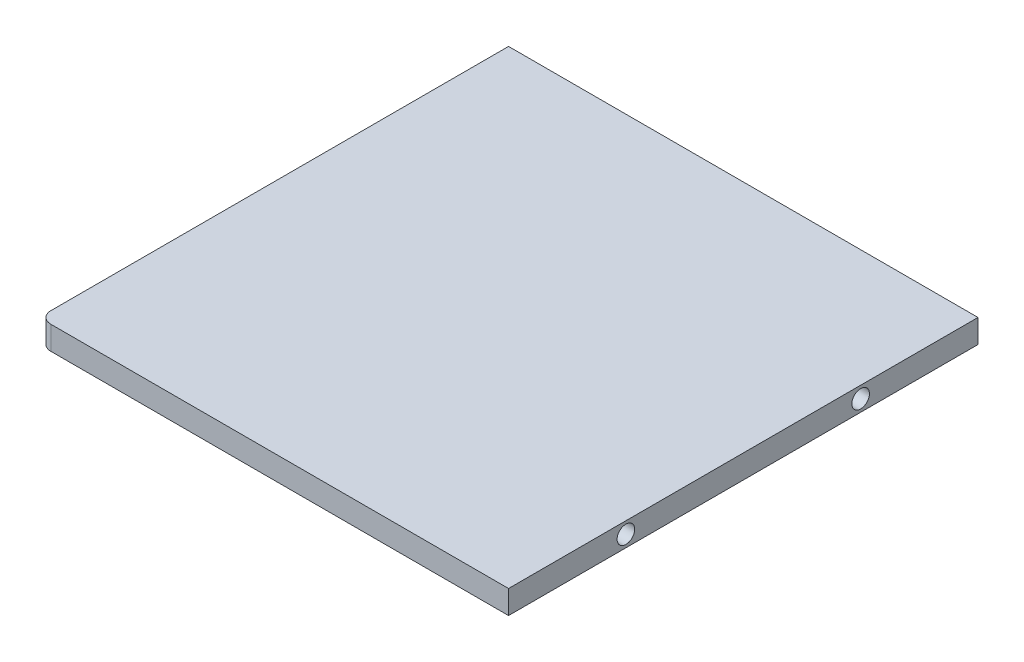
ISO-10303-21;
HEADER;
FILE_DESCRIPTION(('STEP AP214'),'2;1');
FILE_NAME('part.step','',(''),(''),'','','');
FILE_SCHEMA(('AUTOMOTIVE_DESIGN { 1 0 10303 214 1 1 1 1 }'));
ENDSEC;
DATA;
#1=APPLICATION_CONTEXT('core data for automotive mechanical design processes');
#2=APPLICATION_PROTOCOL_DEFINITION('international standard','automotive_design',2000,#1);
#3=PRODUCT_CONTEXT('',#1,'mechanical');
#4=PRODUCT('Part','Part','',(#3));
#5=PRODUCT_RELATED_PRODUCT_CATEGORY('part','',(#4));
#6=PRODUCT_DEFINITION_FORMATION('','',#4);
#7=PRODUCT_DEFINITION_CONTEXT('part definition',#1,'design');
#8=PRODUCT_DEFINITION('design','',#6,#7);
#9=PRODUCT_DEFINITION_SHAPE('','',#8);
#10=(LENGTH_UNIT() NAMED_UNIT(*) SI_UNIT(.MILLI.,.METRE.));
#11=(NAMED_UNIT(*) PLANE_ANGLE_UNIT() SI_UNIT($,.RADIAN.));
#12=(NAMED_UNIT(*) SI_UNIT($,.STERADIAN.) SOLID_ANGLE_UNIT());
#13=UNCERTAINTY_MEASURE_WITH_UNIT(LENGTH_MEASURE(1.E-05),#10,'distance_accuracy_value','');
#14=(GEOMETRIC_REPRESENTATION_CONTEXT(3) GLOBAL_UNCERTAINTY_ASSIGNED_CONTEXT((#13)) GLOBAL_UNIT_ASSIGNED_CONTEXT((#10,
#11,#12)) REPRESENTATION_CONTEXT('',''));
#15=CARTESIAN_POINT('',(0.,0.,0.));
#16=DIRECTION('',(0.,0.,1.));
#17=DIRECTION('',(1.,0.,0.));
#18=AXIS2_PLACEMENT_3D('',#15,#16,#17);
#19=CARTESIAN_POINT('',(80.,-2.,0.));
#20=DIRECTION('',(0.,-1.,0.));
#21=DIRECTION('',(0.,0.,-1.));
#22=AXIS2_PLACEMENT_3D('',#19,#20,#21);
#23=PLANE('',#22);
#24=CARTESIAN_POINT('',(6.5,-2.,-3.75));
#25=DIRECTION('',(0.,-1.,0.));
#26=DIRECTION('',(0.,0.,-1.));
#27=AXIS2_PLACEMENT_3D('',#24,#25,#26);
#28=CIRCLE('',#27,0.749999999999998);
#29=CARTESIAN_POINT('',(6.5,-2.,-4.5));
#30=VERTEX_POINT('',#29);
#31=EDGE_CURVE('E220',#30,#30,#28,.T.);
#32=ORIENTED_EDGE('',*,*,#31,.F.);
#33=EDGE_LOOP('',(#32));
#34=FACE_BOUND('',#33,.T.);
#35=DIRECTION('',(0.,0.,1.));
#36=VECTOR('',#35,1.);
#37=CARTESIAN_POINT('',(40.,-2.,0.));
#38=LINE('',#37,#36);
#39=CARTESIAN_POINT('',(40.,-2.,-40.0000000000008));
#40=VERTEX_POINT('',#39);
#41=CARTESIAN_POINT('',(40.,-2.,0.));
#42=VERTEX_POINT('',#41);
#43=EDGE_CURVE('E99',#40,#42,#38,.T.);
#44=ORIENTED_EDGE('',*,*,#43,.T.);
#45=DIRECTION('',(-1.,0.,0.));
#46=VECTOR('',#45,1.);
#47=CARTESIAN_POINT('',(80.,-2.,0.));
#48=LINE('',#47,#46);
#49=CARTESIAN_POINT('',(1.,-2.,0.));
#50=VERTEX_POINT('',#49);
#51=EDGE_CURVE('E64',#42,#50,#48,.T.);
#52=ORIENTED_EDGE('',*,*,#51,.T.);
#53=CARTESIAN_POINT('',(1.,-2.,-1.));
#54=DIRECTION('',(0.,-1.,0.));
#55=DIRECTION('',(0.,0.,-1.));
#56=AXIS2_PLACEMENT_3D('',#53,#54,#55);
#57=CIRCLE('',#56,1.);
#58=CARTESIAN_POINT('',(0.,-2.,-1.));
#59=VERTEX_POINT('',#58);
#60=EDGE_CURVE('E11',#50,#59,#57,.T.);
#61=ORIENTED_EDGE('',*,*,#60,.T.);
#62=DIRECTION('',(0.,0.,1.));
#63=VECTOR('',#62,1.);
#64=CARTESIAN_POINT('',(0.,-2.,0.));
#65=LINE('',#64,#63);
#66=CARTESIAN_POINT('',(0.,-1.99999999999999,-40.0000000000008));
#67=VERTEX_POINT('',#66);
#68=EDGE_CURVE('E105',#67,#59,#65,.T.);
#69=ORIENTED_EDGE('',*,*,#68,.F.);
#70=DIRECTION('',(1.,0.,0.));
#71=VECTOR('',#70,1.);
#72=CARTESIAN_POINT('',(0.,-2.,-40.0000000000008));
#73=LINE('',#72,#71);
#74=EDGE_CURVE('E57',#67,#40,#73,.T.);
#75=ORIENTED_EDGE('',*,*,#74,.T.);
#76=EDGE_LOOP('',(#44,#52,#61,#69,#75));
#77=FACE_BOUND('',#76,.T.);
#78=ADVANCED_FACE('F41',(#34,#77),#23,.T.);
#79=CARTESIAN_POINT('',(80.,0.,0.));
#80=DIRECTION('',(0.,1.,0.));
#81=DIRECTION('',(0.,0.,1.));
#82=AXIS2_PLACEMENT_3D('',#79,#80,#81);
#83=PLANE('',#82);
#84=DIRECTION('',(0.,0.,1.));
#85=VECTOR('',#84,1.);
#86=CARTESIAN_POINT('',(40.,0.,0.));
#87=LINE('',#86,#85);
#88=CARTESIAN_POINT('',(40.,0.,-40.0000000000008));
#89=VERTEX_POINT('',#88);
#90=CARTESIAN_POINT('',(40.,0.,0.));
#91=VERTEX_POINT('',#90);
#92=EDGE_CURVE('E123',#89,#91,#87,.T.);
#93=ORIENTED_EDGE('',*,*,#92,.F.);
#94=DIRECTION('',(1.,0.,0.));
#95=VECTOR('',#94,1.);
#96=CARTESIAN_POINT('',(80.,0.,-40.0000000000008));
#97=LINE('',#96,#95);
#98=CARTESIAN_POINT('',(0.,0.,-40.0000000000008));
#99=VERTEX_POINT('',#98);
#100=EDGE_CURVE('E92',#99,#89,#97,.T.);
#101=ORIENTED_EDGE('',*,*,#100,.F.);
#102=DIRECTION('',(0.,0.,-1.));
#103=VECTOR('',#102,1.);
#104=CARTESIAN_POINT('',(0.,0.,0.));
#105=LINE('',#104,#103);
#106=CARTESIAN_POINT('',(0.,0.,-1.));
#107=VERTEX_POINT('',#106);
#108=EDGE_CURVE('E128',#107,#99,#105,.T.);
#109=ORIENTED_EDGE('',*,*,#108,.F.);
#110=CARTESIAN_POINT('',(1.,0.,-1.));
#111=DIRECTION('',(0.,1.,0.));
#112=DIRECTION('',(0.,0.,1.));
#113=AXIS2_PLACEMENT_3D('',#110,#111,#112);
#114=CIRCLE('',#113,1.);
#115=CARTESIAN_POINT('',(1.,0.,0.));
#116=VERTEX_POINT('',#115);
#117=EDGE_CURVE('E141',#107,#116,#114,.T.);
#118=ORIENTED_EDGE('',*,*,#117,.T.);
#119=DIRECTION('',(-1.,0.,0.));
#120=VECTOR('',#119,1.);
#121=CARTESIAN_POINT('',(80.,0.,0.));
#122=LINE('',#121,#120);
#123=EDGE_CURVE('E134',#91,#116,#122,.T.);
#124=ORIENTED_EDGE('',*,*,#123,.F.);
#125=EDGE_LOOP('',(#93,#101,#109,#118,#124));
#126=FACE_BOUND('',#125,.T.);
#127=ADVANCED_FACE('F156',(#126),#83,.T.);
#128=CARTESIAN_POINT('',(80.,0.,0.));
#129=DIRECTION('',(0.,0.,1.));
#130=DIRECTION('',(1.,0.,0.));
#131=AXIS2_PLACEMENT_3D('',#128,#129,#130);
#132=PLANE('',#131);
#133=DIRECTION('',(0.,1.,0.));
#134=VECTOR('',#133,1.);
#135=CARTESIAN_POINT('',(40.,-2.,0.));
#136=LINE('',#135,#134);
#137=EDGE_CURVE('E96',#42,#91,#136,.T.);
#138=ORIENTED_EDGE('',*,*,#137,.T.);
#139=ORIENTED_EDGE('',*,*,#123,.T.);
#140=DIRECTION('',(0.,1.,0.));
#141=VECTOR('',#140,1.);
#142=CARTESIAN_POINT('',(1.,-2.,0.));
#143=LINE('',#142,#141);
#144=EDGE_CURVE('E50',#116,#50,#143,.F.);
#145=ORIENTED_EDGE('',*,*,#144,.T.);
#146=ORIENTED_EDGE('',*,*,#51,.F.);
#147=EDGE_LOOP('',(#138,#139,#145,#146));
#148=FACE_BOUND('',#147,.T.);
#149=ADVANCED_FACE('F148',(#148),#132,.T.);
#150=CARTESIAN_POINT('',(0.,0.,0.));
#151=DIRECTION('',(1.,0.,0.));
#152=DIRECTION('',(0.,0.,-1.));
#153=AXIS2_PLACEMENT_3D('',#150,#151,#152);
#154=PLANE('',#153);
#155=ORIENTED_EDGE('',*,*,#108,.T.);
#156=DIRECTION('',(0.,1.,0.));
#157=VECTOR('',#156,1.);
#158=CARTESIAN_POINT('',(0.,-2.,-40.0000000000008));
#159=LINE('',#158,#157);
#160=EDGE_CURVE('E97',#67,#99,#159,.T.);
#161=ORIENTED_EDGE('',*,*,#160,.F.);
#162=ORIENTED_EDGE('',*,*,#68,.T.);
#163=DIRECTION('',(0.,1.,0.));
#164=VECTOR('',#163,1.);
#165=CARTESIAN_POINT('',(0.,0.,-1.));
#166=LINE('',#165,#164);
#167=EDGE_CURVE('E137',#59,#107,#166,.T.);
#168=ORIENTED_EDGE('',*,*,#167,.T.);
#169=EDGE_LOOP('',(#155,#161,#162,#168));
#170=FACE_BOUND('',#169,.T.);
#171=ADVANCED_FACE('F154',(#170),#154,.F.);
#172=CARTESIAN_POINT('',(1.,0.,-1.));
#173=DIRECTION('',(0.,-1.,0.));
#174=DIRECTION('',(0.,0.,-1.));
#175=AXIS2_PLACEMENT_3D('',#172,#173,#174);
#176=CYLINDRICAL_SURFACE('',#175,1.);
#177=ORIENTED_EDGE('',*,*,#60,.F.);
#178=ORIENTED_EDGE('',*,*,#144,.F.);
#179=ORIENTED_EDGE('',*,*,#117,.F.);
#180=ORIENTED_EDGE('',*,*,#167,.F.);
#181=EDGE_LOOP('',(#177,#178,#179,#180));
#182=FACE_BOUND('',#181,.T.);
#183=ADVANCED_FACE('F43',(#182),#176,.T.);
#184=CARTESIAN_POINT('',(40.,-2.,0.));
#185=DIRECTION('',(-1.,0.,0.));
#186=DIRECTION('',(0.,0.,1.));
#187=AXIS2_PLACEMENT_3D('',#184,#185,#186);
#188=PLANE('',#187);
#189=CARTESIAN_POINT('',(40.,-1.,-10.));
#190=DIRECTION('',(1.,0.,0.));
#191=DIRECTION('',(0.,0.,-1.));
#192=AXIS2_PLACEMENT_3D('',#189,#190,#191);
#193=CIRCLE('',#192,0.75);
#194=CARTESIAN_POINT('',(40.,-1.,-10.75));
#195=VERTEX_POINT('',#194);
#196=EDGE_CURVE('E234',#195,#195,#193,.T.);
#197=ORIENTED_EDGE('',*,*,#196,.F.);
#198=EDGE_LOOP('',(#197));
#199=FACE_BOUND('',#198,.T.);
#200=CARTESIAN_POINT('',(40.,-1.,-30.0000000000008));
#201=DIRECTION('',(1.,0.,0.));
#202=DIRECTION('',(0.,0.,-1.));
#203=AXIS2_PLACEMENT_3D('',#200,#201,#202);
#204=CIRCLE('',#203,0.750000000000002);
#205=CARTESIAN_POINT('',(40.,-1.,-30.7500000000008));
#206=VERTEX_POINT('',#205);
#207=EDGE_CURVE('E225',#206,#206,#204,.T.);
#208=ORIENTED_EDGE('',*,*,#207,.F.);
#209=EDGE_LOOP('',(#208));
#210=FACE_BOUND('',#209,.T.);
#211=ORIENTED_EDGE('',*,*,#92,.T.);
#212=ORIENTED_EDGE('',*,*,#137,.F.);
#213=ORIENTED_EDGE('',*,*,#43,.F.);
#214=DIRECTION('',(0.,1.,0.));
#215=VECTOR('',#214,1.);
#216=CARTESIAN_POINT('',(40.,-2.,-40.0000000000008));
#217=LINE('',#216,#215);
#218=EDGE_CURVE('E88',#40,#89,#217,.T.);
#219=ORIENTED_EDGE('',*,*,#218,.T.);
#220=EDGE_LOOP('',(#211,#212,#213,#219));
#221=FACE_BOUND('',#220,.T.);
#222=ADVANCED_FACE('F100',(#199,#210,#221),#188,.F.);
#223=CARTESIAN_POINT('',(0.,-2.,-40.0000000000008));
#224=DIRECTION('',(0.,0.,1.));
#225=DIRECTION('',(1.,0.,0.));
#226=AXIS2_PLACEMENT_3D('',#223,#224,#225);
#227=PLANE('',#226);
#228=CARTESIAN_POINT('',(30.,-1.,-40.0000000000008));
#229=DIRECTION('',(0.,0.,-1.));
#230=DIRECTION('',(-1.,0.,0.));
#231=AXIS2_PLACEMENT_3D('',#228,#229,#230);
#232=CIRCLE('',#231,0.750000000000002);
#233=CARTESIAN_POINT('',(29.25,-1.,-40.0000000000008));
#234=VERTEX_POINT('',#233);
#235=EDGE_CURVE('E111',#234,#234,#232,.T.);
#236=ORIENTED_EDGE('',*,*,#235,.F.);
#237=EDGE_LOOP('',(#236));
#238=FACE_BOUND('',#237,.T.);
#239=CARTESIAN_POINT('',(9.99999999999999,-0.999999999999998,-40.0000000000008));
#240=DIRECTION('',(0.,0.,-1.));
#241=DIRECTION('',(-1.,0.,0.));
#242=AXIS2_PLACEMENT_3D('',#239,#240,#241);
#243=CIRCLE('',#242,0.75);
#244=CARTESIAN_POINT('',(9.24999999999999,-0.999999999999998,-40.0000000000008));
#245=VERTEX_POINT('',#244);
#246=EDGE_CURVE('E243',#245,#245,#243,.T.);
#247=ORIENTED_EDGE('',*,*,#246,.F.);
#248=EDGE_LOOP('',(#247));
#249=FACE_BOUND('',#248,.T.);
#250=ORIENTED_EDGE('',*,*,#100,.T.);
#251=ORIENTED_EDGE('',*,*,#218,.F.);
#252=ORIENTED_EDGE('',*,*,#74,.F.);
#253=ORIENTED_EDGE('',*,*,#160,.T.);
#254=EDGE_LOOP('',(#250,#251,#252,#253));
#255=FACE_BOUND('',#254,.T.);
#256=ADVANCED_FACE('F90',(#238,#249,#255),#227,.F.);
#257=CARTESIAN_POINT('',(9.99999999999999,-0.999999999999998,-35.0000000000008));
#258=DIRECTION('',(0.,0.,-1.));
#259=DIRECTION('',(-1.,0.,0.));
#260=AXIS2_PLACEMENT_3D('',#257,#258,#259);
#261=CYLINDRICAL_SURFACE('',#260,0.75);
#262=CARTESIAN_POINT('',(9.99999999999999,-0.999999999999998,-35.0000000000008));
#263=DIRECTION('',(0.,0.,-1.));
#264=DIRECTION('',(-1.,0.,0.));
#265=AXIS2_PLACEMENT_3D('',#262,#263,#264);
#266=CIRCLE('',#265,0.75);
#267=CARTESIAN_POINT('',(9.24999999999999,-0.999999999999998,-35.0000000000008));
#268=VERTEX_POINT('',#267);
#269=EDGE_CURVE('E114',#268,#268,#266,.T.);
#270=ORIENTED_EDGE('',*,*,#269,.F.);
#271=EDGE_LOOP('',(#270));
#272=FACE_BOUND('',#271,.T.);
#273=ORIENTED_EDGE('',*,*,#246,.T.);
#274=EDGE_LOOP('',(#273));
#275=FACE_BOUND('',#274,.T.);
#276=ADVANCED_FACE('F170',(#272,#275),#261,.F.);
#277=CARTESIAN_POINT('',(9.99999999999999,-0.999999999999998,-35.0000000000008));
#278=DIRECTION('',(0.,0.,-1.));
#279=DIRECTION('',(-1.,0.,0.));
#280=AXIS2_PLACEMENT_3D('',#277,#278,#279);
#281=PLANE('',#280);
#282=ORIENTED_EDGE('',*,*,#269,.T.);
#283=EDGE_LOOP('',(#282));
#284=FACE_BOUND('',#283,.T.);
#285=ADVANCED_FACE('F175',(#284),#281,.T.);
#286=CARTESIAN_POINT('',(30.,-1.,-35.0000000000008));
#287=DIRECTION('',(0.,0.,-1.));
#288=DIRECTION('',(-1.,0.,0.));
#289=AXIS2_PLACEMENT_3D('',#286,#287,#288);
#290=CYLINDRICAL_SURFACE('',#289,0.750000000000002);
#291=CARTESIAN_POINT('',(30.,-1.,-35.0000000000008));
#292=DIRECTION('',(0.,0.,-1.));
#293=DIRECTION('',(-1.,0.,0.));
#294=AXIS2_PLACEMENT_3D('',#291,#292,#293);
#295=CIRCLE('',#294,0.750000000000002);
#296=CARTESIAN_POINT('',(29.25,-1.,-35.0000000000008));
#297=VERTEX_POINT('',#296);
#298=EDGE_CURVE('E107',#297,#297,#295,.T.);
#299=ORIENTED_EDGE('',*,*,#298,.F.);
#300=EDGE_LOOP('',(#299));
#301=FACE_BOUND('',#300,.T.);
#302=ORIENTED_EDGE('',*,*,#235,.T.);
#303=EDGE_LOOP('',(#302));
#304=FACE_BOUND('',#303,.T.);
#305=ADVANCED_FACE('F178',(#301,#304),#290,.F.);
#306=CARTESIAN_POINT('',(30.,-1.,-35.0000000000008));
#307=DIRECTION('',(0.,0.,-1.));
#308=DIRECTION('',(-1.,0.,0.));
#309=AXIS2_PLACEMENT_3D('',#306,#307,#308);
#310=PLANE('',#309);
#311=ORIENTED_EDGE('',*,*,#298,.T.);
#312=EDGE_LOOP('',(#311));
#313=FACE_BOUND('',#312,.T.);
#314=ADVANCED_FACE('F185',(#313),#310,.T.);
#315=CARTESIAN_POINT('',(35.,-1.,-30.0000000000008));
#316=DIRECTION('',(1.,0.,0.));
#317=DIRECTION('',(0.,0.,-1.));
#318=AXIS2_PLACEMENT_3D('',#315,#316,#317);
#319=CYLINDRICAL_SURFACE('',#318,0.750000000000002);
#320=CARTESIAN_POINT('',(35.,-1.,-30.0000000000008));
#321=DIRECTION('',(1.,0.,0.));
#322=DIRECTION('',(0.,0.,-1.));
#323=AXIS2_PLACEMENT_3D('',#320,#321,#322);
#324=CIRCLE('',#323,0.750000000000002);
#325=CARTESIAN_POINT('',(35.,-1.,-30.7500000000008));
#326=VERTEX_POINT('',#325);
#327=EDGE_CURVE('E219',#326,#326,#324,.T.);
#328=ORIENTED_EDGE('',*,*,#327,.F.);
#329=EDGE_LOOP('',(#328));
#330=FACE_BOUND('',#329,.T.);
#331=ORIENTED_EDGE('',*,*,#207,.T.);
#332=EDGE_LOOP('',(#331));
#333=FACE_BOUND('',#332,.T.);
#334=ADVANCED_FACE('F189',(#330,#333),#319,.F.);
#335=CARTESIAN_POINT('',(35.,-1.,-30.0000000000008));
#336=DIRECTION('',(1.,0.,0.));
#337=DIRECTION('',(0.,0.,-1.));
#338=AXIS2_PLACEMENT_3D('',#335,#336,#337);
#339=PLANE('',#338);
#340=ORIENTED_EDGE('',*,*,#327,.T.);
#341=EDGE_LOOP('',(#340));
#342=FACE_BOUND('',#341,.T.);
#343=ADVANCED_FACE('F191',(#342),#339,.T.);
#344=CARTESIAN_POINT('',(35.,-1.,-10.));
#345=DIRECTION('',(1.,0.,0.));
#346=DIRECTION('',(0.,0.,-1.));
#347=AXIS2_PLACEMENT_3D('',#344,#345,#346);
#348=CYLINDRICAL_SURFACE('',#347,0.75);
#349=CARTESIAN_POINT('',(35.,-1.,-10.));
#350=DIRECTION('',(1.,0.,0.));
#351=DIRECTION('',(0.,0.,-1.));
#352=AXIS2_PLACEMENT_3D('',#349,#350,#351);
#353=CIRCLE('',#352,0.75);
#354=CARTESIAN_POINT('',(35.,-1.,-10.75));
#355=VERTEX_POINT('',#354);
#356=EDGE_CURVE('E230',#355,#355,#353,.T.);
#357=ORIENTED_EDGE('',*,*,#356,.F.);
#358=EDGE_LOOP('',(#357));
#359=FACE_BOUND('',#358,.T.);
#360=ORIENTED_EDGE('',*,*,#196,.T.);
#361=EDGE_LOOP('',(#360));
#362=FACE_BOUND('',#361,.T.);
#363=ADVANCED_FACE('F194',(#359,#362),#348,.F.);
#364=CARTESIAN_POINT('',(35.,-1.,-10.));
#365=DIRECTION('',(1.,0.,0.));
#366=DIRECTION('',(0.,0.,-1.));
#367=AXIS2_PLACEMENT_3D('',#364,#365,#366);
#368=PLANE('',#367);
#369=ORIENTED_EDGE('',*,*,#356,.T.);
#370=EDGE_LOOP('',(#369));
#371=FACE_BOUND('',#370,.T.);
#372=ADVANCED_FACE('F201',(#371),#368,.T.);
#373=CARTESIAN_POINT('',(6.5,-1.,-3.75));
#374=DIRECTION('',(0.,-1.,0.));
#375=DIRECTION('',(0.,0.,-1.));
#376=AXIS2_PLACEMENT_3D('',#373,#374,#375);
#377=CYLINDRICAL_SURFACE('',#376,0.749999999999998);
#378=CARTESIAN_POINT('',(6.5,-1.,-3.75));
#379=DIRECTION('',(0.,-1.,0.));
#380=DIRECTION('',(0.,0.,-1.));
#381=AXIS2_PLACEMENT_3D('',#378,#379,#380);
#382=CIRCLE('',#381,0.749999999999998);
#383=CARTESIAN_POINT('',(6.5,-1.,-4.5));
#384=VERTEX_POINT('',#383);
#385=EDGE_CURVE('E217',#384,#384,#382,.T.);
#386=ORIENTED_EDGE('',*,*,#385,.F.);
#387=EDGE_LOOP('',(#386));
#388=FACE_BOUND('',#387,.T.);
#389=ORIENTED_EDGE('',*,*,#31,.T.);
#390=EDGE_LOOP('',(#389));
#391=FACE_BOUND('',#390,.T.);
#392=ADVANCED_FACE('F205',(#388,#391),#377,.F.);
#393=CARTESIAN_POINT('',(6.5,-1.,-3.75));
#394=DIRECTION('',(0.,-1.,0.));
#395=DIRECTION('',(0.,0.,-1.));
#396=AXIS2_PLACEMENT_3D('',#393,#394,#395);
#397=PLANE('',#396);
#398=ORIENTED_EDGE('',*,*,#385,.T.);
#399=EDGE_LOOP('',(#398));
#400=FACE_BOUND('',#399,.T.);
#401=ADVANCED_FACE('F209',(#400),#397,.T.);
#402=CLOSED_SHELL('',(#78,#127,#149,#171,#183,#222,#256,#276,#285,#305,#314,#334,#343,#363,#372,
#392,#401));
#403=MANIFOLD_SOLID_BREP('B2',#402);
#404=ADVANCED_BREP_SHAPE_REPRESENTATION('',(#18,#403),#14);
#405=SHAPE_DEFINITION_REPRESENTATION(#9,#404);
ENDSEC;
END-ISO-10303-21;
